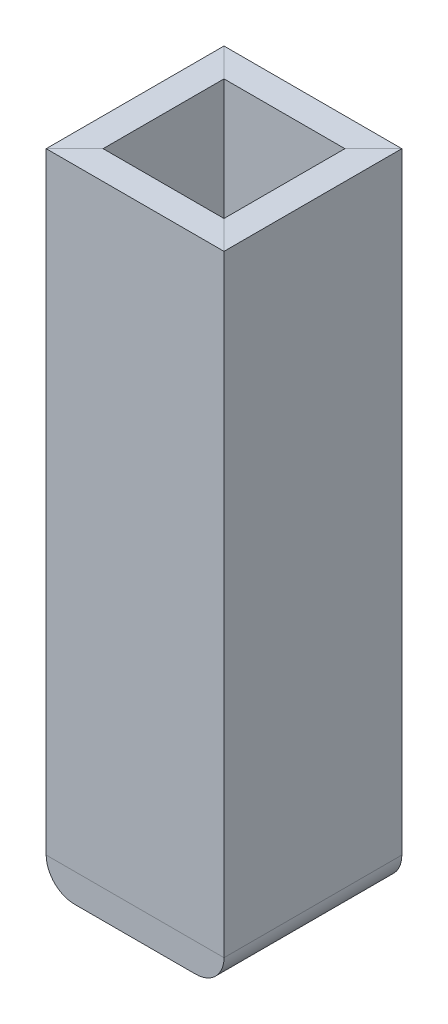
ISO-10303-21;
HEADER;
FILE_DESCRIPTION(('STEP AP214'),'2;1');
FILE_NAME('part.step','',(''),(''),'','','');
FILE_SCHEMA(('AUTOMOTIVE_DESIGN { 1 0 10303 214 1 1 1 1 }'));
ENDSEC;
DATA;
#1=APPLICATION_CONTEXT('core data for automotive mechanical design processes');
#2=APPLICATION_PROTOCOL_DEFINITION('international standard','automotive_design',2000,#1);
#3=PRODUCT_CONTEXT('',#1,'mechanical');
#4=PRODUCT('Part','Part','',(#3));
#5=PRODUCT_RELATED_PRODUCT_CATEGORY('part','',(#4));
#6=PRODUCT_DEFINITION_FORMATION('','',#4);
#7=PRODUCT_DEFINITION_CONTEXT('part definition',#1,'design');
#8=PRODUCT_DEFINITION('design','',#6,#7);
#9=PRODUCT_DEFINITION_SHAPE('','',#8);
#10=(LENGTH_UNIT() NAMED_UNIT(*) SI_UNIT(.MILLI.,.METRE.));
#11=(NAMED_UNIT(*) PLANE_ANGLE_UNIT() SI_UNIT($,.RADIAN.));
#12=(NAMED_UNIT(*) SI_UNIT($,.STERADIAN.) SOLID_ANGLE_UNIT());
#13=UNCERTAINTY_MEASURE_WITH_UNIT(LENGTH_MEASURE(1.E-05),#10,'distance_accuracy_value','');
#14=(GEOMETRIC_REPRESENTATION_CONTEXT(3) GLOBAL_UNCERTAINTY_ASSIGNED_CONTEXT((#13)) GLOBAL_UNIT_ASSIGNED_CONTEXT((#10,
#11,#12)) REPRESENTATION_CONTEXT('',''));
#15=CARTESIAN_POINT('',(0.,0.,0.));
#16=DIRECTION('',(0.,0.,1.));
#17=DIRECTION('',(1.,0.,0.));
#18=AXIS2_PLACEMENT_3D('',#15,#16,#17);
#19=CARTESIAN_POINT('',(0.,0.,0.));
#20=DIRECTION('',(-0.707106781186548,0.,0.707106781186547));
#21=DIRECTION('',(0.707106781186547,0.,0.707106781186548));
#22=AXIS2_PLACEMENT_3D('',#19,#20,#21);
#23=PLANE('',#22);
#24=DIRECTION('',(0.707106781186547,0.,0.707106781186548));
#25=VECTOR('',#24,1.);
#26=CARTESIAN_POINT('',(0.,2.,0.));
#27=LINE('',#26,#25);
#28=CARTESIAN_POINT('',(4.25,2.,4.25));
#29=VERTEX_POINT('',#28);
#30=CARTESIAN_POINT('',(6.25,2.00000000000002,6.25));
#31=VERTEX_POINT('',#30);
#32=EDGE_CURVE('E117',#29,#31,#27,.T.);
#33=ORIENTED_EDGE('',*,*,#32,.T.);
#34=DIRECTION('',(0.,-1.,0.));
#35=VECTOR('',#34,1.);
#36=CARTESIAN_POINT('',(6.25,45.,6.25));
#37=LINE('',#36,#35);
#38=CARTESIAN_POINT('',(6.25,45.,6.25));
#39=VERTEX_POINT('',#38);
#40=EDGE_CURVE('E77',#39,#31,#37,.T.);
#41=ORIENTED_EDGE('',*,*,#40,.F.);
#42=DIRECTION('',(-0.707106781186547,0.,-0.707106781186548));
#43=VECTOR('',#42,1.);
#44=CARTESIAN_POINT('',(0.,45.,0.));
#45=LINE('',#44,#43);
#46=CARTESIAN_POINT('',(4.25,45.,4.25));
#47=VERTEX_POINT('',#46);
#48=EDGE_CURVE('E143',#39,#47,#45,.T.);
#49=ORIENTED_EDGE('',*,*,#48,.T.);
#50=DIRECTION('',(0.,1.,0.));
#51=VECTOR('',#50,1.);
#52=CARTESIAN_POINT('',(4.25,-12.0208152801713,4.25));
#53=LINE('',#52,#51);
#54=EDGE_CURVE('E69',#29,#47,#53,.T.);
#55=ORIENTED_EDGE('',*,*,#54,.F.);
#56=EDGE_LOOP('',(#33,#41,#49,#55));
#57=FACE_BOUND('',#56,.T.);
#58=ADVANCED_FACE('F59',(#57),#23,.T.);
#59=CARTESIAN_POINT('',(4.25,2.,-4.25));
#60=DIRECTION('',(0.,1.,0.));
#61=DIRECTION('',(0.,0.,1.));
#62=AXIS2_PLACEMENT_3D('',#59,#60,#61);
#63=PLANE('',#62);
#64=ORIENTED_EDGE('',*,*,#32,.F.);
#65=DIRECTION('',(0.,0.,-1.));
#66=VECTOR('',#65,1.);
#67=CARTESIAN_POINT('',(4.25,2.,4.25));
#68=LINE('',#67,#66);
#69=CARTESIAN_POINT('',(4.25,2.,-4.25));
#70=VERTEX_POINT('',#69);
#71=EDGE_CURVE('E109',#29,#70,#68,.T.);
#72=ORIENTED_EDGE('',*,*,#71,.T.);
#73=DIRECTION('',(0.707106781186547,0.,-0.707106781186548));
#74=VECTOR('',#73,1.);
#75=CARTESIAN_POINT('',(4.25,2.,-4.25));
#76=LINE('',#75,#74);
#77=CARTESIAN_POINT('',(6.25,2.00000000000002,-6.25));
#78=VERTEX_POINT('',#77);
#79=EDGE_CURVE('E110',#70,#78,#76,.T.);
#80=ORIENTED_EDGE('',*,*,#79,.T.);
#81=DIRECTION('',(0.,0.,-1.));
#82=VECTOR('',#81,1.);
#83=CARTESIAN_POINT('',(6.25,2.,-6.25));
#84=LINE('',#83,#82);
#85=EDGE_CURVE('E141',#31,#78,#84,.T.);
#86=ORIENTED_EDGE('',*,*,#85,.F.);
#87=EDGE_LOOP('',(#64,#72,#80,#86));
#88=FACE_BOUND('',#87,.T.);
#89=ADVANCED_FACE('F130',(#88),#63,.F.);
#90=CARTESIAN_POINT('',(0.,0.,0.));
#91=DIRECTION('',(0.707106781186548,0.,0.707106781186547));
#92=DIRECTION('',(0.707106781186547,0.,-0.707106781186548));
#93=AXIS2_PLACEMENT_3D('',#90,#91,#92);
#94=PLANE('',#93);
#95=DIRECTION('',(0.,1.,0.));
#96=VECTOR('',#95,1.);
#97=CARTESIAN_POINT('',(4.25,-12.0208152801713,-4.25));
#98=LINE('',#97,#96);
#99=CARTESIAN_POINT('',(4.25,45.,-4.25));
#100=VERTEX_POINT('',#99);
#101=EDGE_CURVE('E112',#70,#100,#98,.T.);
#102=ORIENTED_EDGE('',*,*,#101,.T.);
#103=DIRECTION('',(-0.707106781186547,0.,0.707106781186548));
#104=VECTOR('',#103,1.);
#105=CARTESIAN_POINT('',(0.,45.,0.));
#106=LINE('',#105,#104);
#107=CARTESIAN_POINT('',(6.25,45.,-6.25));
#108=VERTEX_POINT('',#107);
#109=EDGE_CURVE('E63',#108,#100,#106,.T.);
#110=ORIENTED_EDGE('',*,*,#109,.F.);
#111=DIRECTION('',(0.,-1.,0.));
#112=VECTOR('',#111,1.);
#113=CARTESIAN_POINT('',(6.25,45.,-6.25));
#114=LINE('',#113,#112);
#115=EDGE_CURVE('E116',#108,#78,#114,.T.);
#116=ORIENTED_EDGE('',*,*,#115,.T.);
#117=ORIENTED_EDGE('',*,*,#79,.F.);
#118=EDGE_LOOP('',(#102,#110,#116,#117));
#119=FACE_BOUND('',#118,.T.);
#120=ADVANCED_FACE('F113',(#119),#94,.F.);
#121=CARTESIAN_POINT('',(0.,45.,0.));
#122=DIRECTION('',(0.,-1.,0.));
#123=DIRECTION('',(0.,0.,-1.));
#124=AXIS2_PLACEMENT_3D('',#121,#122,#123);
#125=PLANE('',#124);
#126=ORIENTED_EDGE('',*,*,#48,.F.);
#127=DIRECTION('',(0.,0.,-1.));
#128=VECTOR('',#127,1.);
#129=CARTESIAN_POINT('',(6.25,45.,6.25));
#130=LINE('',#129,#128);
#131=EDGE_CURVE('E105',#39,#108,#130,.T.);
#132=ORIENTED_EDGE('',*,*,#131,.T.);
#133=ORIENTED_EDGE('',*,*,#109,.T.);
#134=DIRECTION('',(0.,0.,-1.));
#135=VECTOR('',#134,1.);
#136=CARTESIAN_POINT('',(4.25,45.,4.25));
#137=LINE('',#136,#135);
#138=EDGE_CURVE('E12',#47,#100,#137,.T.);
#139=ORIENTED_EDGE('',*,*,#138,.F.);
#140=EDGE_LOOP('',(#126,#132,#133,#139));
#141=FACE_BOUND('',#140,.T.);
#142=ADVANCED_FACE('F61',(#141),#125,.F.);
#143=CARTESIAN_POINT('',(4.25,-12.0208152801713,4.25));
#144=DIRECTION('',(1.,0.,0.));
#145=DIRECTION('',(0.,0.,-1.));
#146=AXIS2_PLACEMENT_3D('',#143,#144,#145);
#147=PLANE('',#146);
#148=ORIENTED_EDGE('',*,*,#54,.T.);
#149=ORIENTED_EDGE('',*,*,#138,.T.);
#150=ORIENTED_EDGE('',*,*,#101,.F.);
#151=ORIENTED_EDGE('',*,*,#71,.F.);
#152=EDGE_LOOP('',(#148,#149,#150,#151));
#153=FACE_BOUND('',#152,.T.);
#154=ADVANCED_FACE('F119',(#153),#147,.F.);
#155=CARTESIAN_POINT('',(6.25,45.,6.25));
#156=DIRECTION('',(-1.,0.,0.));
#157=DIRECTION('',(0.,0.,1.));
#158=AXIS2_PLACEMENT_3D('',#155,#156,#157);
#159=PLANE('',#158);
#160=ORIENTED_EDGE('',*,*,#40,.T.);
#161=ORIENTED_EDGE('',*,*,#85,.T.);
#162=ORIENTED_EDGE('',*,*,#115,.F.);
#163=ORIENTED_EDGE('',*,*,#131,.F.);
#164=EDGE_LOOP('',(#160,#161,#162,#163));
#165=FACE_BOUND('',#164,.T.);
#166=ADVANCED_FACE('F121',(#165),#159,.F.);
#167=CLOSED_SHELL('',(#58,#89,#120,#142,#154,#166));
#168=MANIFOLD_SOLID_BREP('B2',#167);
#169=CARTESIAN_POINT('',(0.,0.,0.));
#170=DIRECTION('',(-0.707106781186548,0.,0.707106781186547));
#171=DIRECTION('',(0.707106781186547,0.,0.707106781186548));
#172=AXIS2_PLACEMENT_3D('',#169,#170,#171);
#173=PLANE('',#172);
#174=DIRECTION('',(0.707106781186547,0.,0.707106781186548));
#175=VECTOR('',#174,1.);
#176=CARTESIAN_POINT('',(0.,2.,0.));
#177=LINE('',#176,#175);
#178=CARTESIAN_POINT('',(4.25,2.,4.25));
#179=VERTEX_POINT('',#178);
#180=CARTESIAN_POINT('',(6.25,2.00000000000002,6.25));
#181=VERTEX_POINT('',#180);
#182=EDGE_CURVE('E203',#179,#181,#177,.T.);
#183=ORIENTED_EDGE('',*,*,#182,.F.);
#184=DIRECTION('',(0.,1.,0.));
#185=VECTOR('',#184,1.);
#186=CARTESIAN_POINT('',(4.25,-12.0208152801713,4.25));
#187=LINE('',#186,#185);
#188=CARTESIAN_POINT('',(4.25,45.,4.25));
#189=VERTEX_POINT('',#188);
#190=EDGE_CURVE('E57',#179,#189,#187,.T.);
#191=ORIENTED_EDGE('',*,*,#190,.T.);
#192=DIRECTION('',(-0.707106781186547,0.,-0.707106781186548));
#193=VECTOR('',#192,1.);
#194=CARTESIAN_POINT('',(0.,45.,0.));
#195=LINE('',#194,#193);
#196=CARTESIAN_POINT('',(6.25,45.,6.25));
#197=VERTEX_POINT('',#196);
#198=EDGE_CURVE('E222',#197,#189,#195,.T.);
#199=ORIENTED_EDGE('',*,*,#198,.F.);
#200=DIRECTION('',(0.,-1.,0.));
#201=VECTOR('',#200,1.);
#202=CARTESIAN_POINT('',(6.25,45.,6.25));
#203=LINE('',#202,#201);
#204=EDGE_CURVE('E208',#197,#181,#203,.T.);
#205=ORIENTED_EDGE('',*,*,#204,.T.);
#206=EDGE_LOOP('',(#183,#191,#199,#205));
#207=FACE_BOUND('',#206,.T.);
#208=ADVANCED_FACE('F200',(#207),#173,.F.);
#209=CARTESIAN_POINT('',(0.,0.,0.));
#210=DIRECTION('',(0.707106781186548,0.,0.707106781186547));
#211=DIRECTION('',(0.707106781186547,0.,-0.707106781186548));
#212=AXIS2_PLACEMENT_3D('',#209,#210,#211);
#213=PLANE('',#212);
#214=DIRECTION('',(0.,-1.,0.));
#215=VECTOR('',#214,1.);
#216=CARTESIAN_POINT('',(-6.25,45.,6.25));
#217=LINE('',#216,#215);
#218=CARTESIAN_POINT('',(-6.25,45.,6.25));
#219=VERTEX_POINT('',#218);
#220=CARTESIAN_POINT('',(-6.25,2.00000000000002,6.25));
#221=VERTEX_POINT('',#220);
#222=EDGE_CURVE('E256',#219,#221,#217,.T.);
#223=ORIENTED_EDGE('',*,*,#222,.F.);
#224=DIRECTION('',(-0.707106781186547,0.,0.707106781186548));
#225=VECTOR('',#224,1.);
#226=CARTESIAN_POINT('',(0.,45.,0.));
#227=LINE('',#226,#225);
#228=CARTESIAN_POINT('',(-4.25,45.,4.25));
#229=VERTEX_POINT('',#228);
#230=EDGE_CURVE('E253',#229,#219,#227,.T.);
#231=ORIENTED_EDGE('',*,*,#230,.F.);
#232=DIRECTION('',(0.,1.,0.));
#233=VECTOR('',#232,1.);
#234=CARTESIAN_POINT('',(-4.25,-12.0208152801713,4.25));
#235=LINE('',#234,#233);
#236=CARTESIAN_POINT('',(-4.25,2.,4.25));
#237=VERTEX_POINT('',#236);
#238=EDGE_CURVE('E243',#237,#229,#235,.T.);
#239=ORIENTED_EDGE('',*,*,#238,.F.);
#240=DIRECTION('',(0.707106781186547,0.,-0.707106781186548));
#241=VECTOR('',#240,1.);
#242=CARTESIAN_POINT('',(4.25,2.,-4.25));
#243=LINE('',#242,#241);
#244=EDGE_CURVE('E257',#221,#237,#243,.T.);
#245=ORIENTED_EDGE('',*,*,#244,.F.);
#246=EDGE_LOOP('',(#223,#231,#239,#245));
#247=FACE_BOUND('',#246,.T.);
#248=ADVANCED_FACE('F254',(#247),#213,.F.);
#249=CARTESIAN_POINT('',(4.25,2.,-4.25));
#250=DIRECTION('',(0.,1.,0.));
#251=DIRECTION('',(0.,0.,1.));
#252=AXIS2_PLACEMENT_3D('',#249,#250,#251);
#253=PLANE('',#252);
#254=DIRECTION('',(1.,0.,0.));
#255=VECTOR('',#254,1.);
#256=CARTESIAN_POINT('',(-4.25,2.,4.25));
#257=LINE('',#256,#255);
#258=EDGE_CURVE('E248',#237,#179,#257,.T.);
#259=ORIENTED_EDGE('',*,*,#258,.T.);
#260=ORIENTED_EDGE('',*,*,#182,.T.);
#261=DIRECTION('',(1.,0.,0.));
#262=VECTOR('',#261,1.);
#263=CARTESIAN_POINT('',(-6.25,2.,6.25));
#264=LINE('',#263,#262);
#265=EDGE_CURVE('E262',#221,#181,#264,.T.);
#266=ORIENTED_EDGE('',*,*,#265,.F.);
#267=ORIENTED_EDGE('',*,*,#244,.T.);
#268=EDGE_LOOP('',(#259,#260,#266,#267));
#269=FACE_BOUND('',#268,.T.);
#270=ADVANCED_FACE('F272',(#269),#253,.F.);
#271=CARTESIAN_POINT('',(0.,45.,0.));
#272=DIRECTION('',(0.,-1.,0.));
#273=DIRECTION('',(0.,0.,-1.));
#274=AXIS2_PLACEMENT_3D('',#271,#272,#273);
#275=PLANE('',#274);
#276=DIRECTION('',(1.,0.,0.));
#277=VECTOR('',#276,1.);
#278=CARTESIAN_POINT('',(-6.25,45.,6.25));
#279=LINE('',#278,#277);
#280=EDGE_CURVE('E250',#219,#197,#279,.T.);
#281=ORIENTED_EDGE('',*,*,#280,.T.);
#282=ORIENTED_EDGE('',*,*,#198,.T.);
#283=DIRECTION('',(1.,0.,0.));
#284=VECTOR('',#283,1.);
#285=CARTESIAN_POINT('',(-4.25,45.,4.25));
#286=LINE('',#285,#284);
#287=EDGE_CURVE('E246',#229,#189,#286,.T.);
#288=ORIENTED_EDGE('',*,*,#287,.F.);
#289=ORIENTED_EDGE('',*,*,#230,.T.);
#290=EDGE_LOOP('',(#281,#282,#288,#289));
#291=FACE_BOUND('',#290,.T.);
#292=ADVANCED_FACE('F259',(#291),#275,.F.);
#293=CARTESIAN_POINT('',(-6.25,45.,6.25));
#294=DIRECTION('',(0.,0.,-1.));
#295=DIRECTION('',(-1.,0.,0.));
#296=AXIS2_PLACEMENT_3D('',#293,#294,#295);
#297=PLANE('',#296);
#298=ORIENTED_EDGE('',*,*,#222,.T.);
#299=ORIENTED_EDGE('',*,*,#265,.T.);
#300=ORIENTED_EDGE('',*,*,#204,.F.);
#301=ORIENTED_EDGE('',*,*,#280,.F.);
#302=EDGE_LOOP('',(#298,#299,#300,#301));
#303=FACE_BOUND('',#302,.T.);
#304=ADVANCED_FACE('F274',(#303),#297,.F.);
#305=CARTESIAN_POINT('',(-4.25,-12.0208152801713,4.25));
#306=DIRECTION('',(0.,0.,1.));
#307=DIRECTION('',(1.,0.,0.));
#308=AXIS2_PLACEMENT_3D('',#305,#306,#307);
#309=PLANE('',#308);
#310=ORIENTED_EDGE('',*,*,#238,.T.);
#311=ORIENTED_EDGE('',*,*,#287,.T.);
#312=ORIENTED_EDGE('',*,*,#190,.F.);
#313=ORIENTED_EDGE('',*,*,#258,.F.);
#314=EDGE_LOOP('',(#310,#311,#312,#313));
#315=FACE_BOUND('',#314,.T.);
#316=ADVANCED_FACE('F245',(#315),#309,.F.);
#317=CLOSED_SHELL('',(#208,#248,#270,#292,#304,#316));
#318=MANIFOLD_SOLID_BREP('B6',#317);
#319=CARTESIAN_POINT('',(0.,0.,0.));
#320=DIRECTION('',(-0.707106781186548,0.,0.707106781186547));
#321=DIRECTION('',(0.707106781186547,0.,0.707106781186548));
#322=AXIS2_PLACEMENT_3D('',#319,#320,#321);
#323=PLANE('',#322);
#324=DIRECTION('',(0.,-1.,0.));
#325=VECTOR('',#324,1.);
#326=CARTESIAN_POINT('',(-6.25,45.,-6.25));
#327=LINE('',#326,#325);
#328=CARTESIAN_POINT('',(-6.25,45.,-6.25));
#329=VERTEX_POINT('',#328);
#330=CARTESIAN_POINT('',(-6.25,2.00000000000002,-6.25));
#331=VERTEX_POINT('',#330);
#332=EDGE_CURVE('E382',#329,#331,#327,.T.);
#333=ORIENTED_EDGE('',*,*,#332,.T.);
#334=DIRECTION('',(0.707106781186547,0.,0.707106781186548));
#335=VECTOR('',#334,1.);
#336=CARTESIAN_POINT('',(0.,2.,0.));
#337=LINE('',#336,#335);
#338=CARTESIAN_POINT('',(-4.25,2.,-4.25));
#339=VERTEX_POINT('',#338);
#340=EDGE_CURVE('E371',#331,#339,#337,.T.);
#341=ORIENTED_EDGE('',*,*,#340,.T.);
#342=DIRECTION('',(0.,1.,0.));
#343=VECTOR('',#342,1.);
#344=CARTESIAN_POINT('',(-4.25,-12.0208152801713,-4.25));
#345=LINE('',#344,#343);
#346=CARTESIAN_POINT('',(-4.25,45.,-4.25));
#347=VERTEX_POINT('',#346);
#348=EDGE_CURVE('E380',#339,#347,#345,.T.);
#349=ORIENTED_EDGE('',*,*,#348,.T.);
#350=DIRECTION('',(-0.707106781186547,0.,-0.707106781186548));
#351=VECTOR('',#350,1.);
#352=CARTESIAN_POINT('',(0.,45.,0.));
#353=LINE('',#352,#351);
#354=EDGE_CURVE('E384',#347,#329,#353,.T.);
#355=ORIENTED_EDGE('',*,*,#354,.T.);
#356=EDGE_LOOP('',(#333,#341,#349,#355));
#357=FACE_BOUND('',#356,.T.);
#358=ADVANCED_FACE('F328',(#357),#323,.T.);
#359=CARTESIAN_POINT('',(4.25,2.,-4.25));
#360=DIRECTION('',(0.,1.,0.));
#361=DIRECTION('',(0.,0.,1.));
#362=AXIS2_PLACEMENT_3D('',#359,#360,#361);
#363=PLANE('',#362);
#364=ORIENTED_EDGE('',*,*,#340,.F.);
#365=DIRECTION('',(-1.,0.,0.));
#366=VECTOR('',#365,1.);
#367=CARTESIAN_POINT('',(-6.25,2.,-6.25));
#368=LINE('',#367,#366);
#369=CARTESIAN_POINT('',(6.25,2.00000000000002,-6.25));
#370=VERTEX_POINT('',#369);
#371=EDGE_CURVE('E375',#370,#331,#368,.T.);
#372=ORIENTED_EDGE('',*,*,#371,.F.);
#373=DIRECTION('',(0.707106781186547,0.,-0.707106781186548));
#374=VECTOR('',#373,1.);
#375=CARTESIAN_POINT('',(4.25,2.,-4.25));
#376=LINE('',#375,#374);
#377=CARTESIAN_POINT('',(4.25,2.,-4.25));
#378=VERTEX_POINT('',#377);
#379=EDGE_CURVE('E336',#378,#370,#376,.T.);
#380=ORIENTED_EDGE('',*,*,#379,.F.);
#381=DIRECTION('',(-1.,0.,0.));
#382=VECTOR('',#381,1.);
#383=CARTESIAN_POINT('',(-4.25,2.,-4.25));
#384=LINE('',#383,#382);
#385=EDGE_CURVE('E368',#378,#339,#384,.T.);
#386=ORIENTED_EDGE('',*,*,#385,.T.);
#387=EDGE_LOOP('',(#364,#372,#380,#386));
#388=FACE_BOUND('',#387,.T.);
#389=ADVANCED_FACE('F330',(#388),#363,.F.);
#390=CARTESIAN_POINT('',(0.,45.,0.));
#391=DIRECTION('',(0.,-1.,0.));
#392=DIRECTION('',(0.,0.,-1.));
#393=AXIS2_PLACEMENT_3D('',#390,#391,#392);
#394=PLANE('',#393);
#395=ORIENTED_EDGE('',*,*,#354,.F.);
#396=DIRECTION('',(-1.,0.,0.));
#397=VECTOR('',#396,1.);
#398=CARTESIAN_POINT('',(-4.25,45.,-4.25));
#399=LINE('',#398,#397);
#400=CARTESIAN_POINT('',(4.25,45.,-4.25));
#401=VERTEX_POINT('',#400);
#402=EDGE_CURVE('E383',#401,#347,#399,.T.);
#403=ORIENTED_EDGE('',*,*,#402,.F.);
#404=DIRECTION('',(-0.707106781186547,0.,0.707106781186548));
#405=VECTOR('',#404,1.);
#406=CARTESIAN_POINT('',(0.,45.,0.));
#407=LINE('',#406,#405);
#408=CARTESIAN_POINT('',(6.25,45.,-6.25));
#409=VERTEX_POINT('',#408);
#410=EDGE_CURVE('E198',#409,#401,#407,.T.);
#411=ORIENTED_EDGE('',*,*,#410,.F.);
#412=DIRECTION('',(-1.,0.,0.));
#413=VECTOR('',#412,1.);
#414=CARTESIAN_POINT('',(-6.25,45.,-6.25));
#415=LINE('',#414,#413);
#416=EDGE_CURVE('E395',#409,#329,#415,.T.);
#417=ORIENTED_EDGE('',*,*,#416,.T.);
#418=EDGE_LOOP('',(#395,#403,#411,#417));
#419=FACE_BOUND('',#418,.T.);
#420=ADVANCED_FACE('F401',(#419),#394,.F.);
#421=CARTESIAN_POINT('',(0.,0.,0.));
#422=DIRECTION('',(0.707106781186548,0.,0.707106781186547));
#423=DIRECTION('',(0.707106781186547,0.,-0.707106781186548));
#424=AXIS2_PLACEMENT_3D('',#421,#422,#423);
#425=PLANE('',#424);
#426=DIRECTION('',(0.,1.,0.));
#427=VECTOR('',#426,1.);
#428=CARTESIAN_POINT('',(4.25,-12.0208152801713,-4.25));
#429=LINE('',#428,#427);
#430=EDGE_CURVE('E342',#378,#401,#429,.T.);
#431=ORIENTED_EDGE('',*,*,#430,.F.);
#432=ORIENTED_EDGE('',*,*,#379,.T.);
#433=DIRECTION('',(0.,-1.,0.));
#434=VECTOR('',#433,1.);
#435=CARTESIAN_POINT('',(6.25,45.,-6.25));
#436=LINE('',#435,#434);
#437=EDGE_CURVE('E350',#409,#370,#436,.T.);
#438=ORIENTED_EDGE('',*,*,#437,.F.);
#439=ORIENTED_EDGE('',*,*,#410,.T.);
#440=EDGE_LOOP('',(#431,#432,#438,#439));
#441=FACE_BOUND('',#440,.T.);
#442=ADVANCED_FACE('F392',(#441),#425,.T.);
#443=CARTESIAN_POINT('',(-4.25,-12.0208152801713,-4.25));
#444=DIRECTION('',(0.,0.,-1.));
#445=DIRECTION('',(-1.,0.,0.));
#446=AXIS2_PLACEMENT_3D('',#443,#444,#445);
#447=PLANE('',#446);
#448=ORIENTED_EDGE('',*,*,#430,.T.);
#449=ORIENTED_EDGE('',*,*,#402,.T.);
#450=ORIENTED_EDGE('',*,*,#348,.F.);
#451=ORIENTED_EDGE('',*,*,#385,.F.);
#452=EDGE_LOOP('',(#448,#449,#450,#451));
#453=FACE_BOUND('',#452,.T.);
#454=ADVANCED_FACE('F386',(#453),#447,.F.);
#455=CARTESIAN_POINT('',(-6.25,45.,-6.25));
#456=DIRECTION('',(0.,0.,1.));
#457=DIRECTION('',(1.,0.,0.));
#458=AXIS2_PLACEMENT_3D('',#455,#456,#457);
#459=PLANE('',#458);
#460=ORIENTED_EDGE('',*,*,#437,.T.);
#461=ORIENTED_EDGE('',*,*,#371,.T.);
#462=ORIENTED_EDGE('',*,*,#332,.F.);
#463=ORIENTED_EDGE('',*,*,#416,.F.);
#464=EDGE_LOOP('',(#460,#461,#462,#463));
#465=FACE_BOUND('',#464,.T.);
#466=ADVANCED_FACE('F402',(#465),#459,.F.);
#467=CLOSED_SHELL('',(#358,#389,#420,#442,#454,#466));
#468=MANIFOLD_SOLID_BREP('B51',#467);
#469=CARTESIAN_POINT('',(0.,0.,0.));
#470=DIRECTION('',(-0.707106781186548,0.,0.707106781186547));
#471=DIRECTION('',(0.707106781186547,0.,0.707106781186548));
#472=AXIS2_PLACEMENT_3D('',#469,#470,#471);
#473=PLANE('',#472);
#474=DIRECTION('',(0.,-1.,0.));
#475=VECTOR('',#474,1.);
#476=CARTESIAN_POINT('',(-6.25,45.,-6.25));
#477=LINE('',#476,#475);
#478=CARTESIAN_POINT('',(-6.25,45.,-6.25));
#479=VERTEX_POINT('',#478);
#480=CARTESIAN_POINT('',(-6.25,2.00000000000002,-6.25));
#481=VERTEX_POINT('',#480);
#482=EDGE_CURVE('E521',#479,#481,#477,.T.);
#483=ORIENTED_EDGE('',*,*,#482,.F.);
#484=DIRECTION('',(-0.707106781186547,0.,-0.707106781186548));
#485=VECTOR('',#484,1.);
#486=CARTESIAN_POINT('',(0.,45.,0.));
#487=LINE('',#486,#485);
#488=CARTESIAN_POINT('',(-4.25,45.,-4.25));
#489=VERTEX_POINT('',#488);
#490=EDGE_CURVE('E462',#489,#479,#487,.T.);
#491=ORIENTED_EDGE('',*,*,#490,.F.);
#492=DIRECTION('',(0.,1.,0.));
#493=VECTOR('',#492,1.);
#494=CARTESIAN_POINT('',(-4.25,-12.0208152801713,-4.25));
#495=LINE('',#494,#493);
#496=CARTESIAN_POINT('',(-4.25,2.,-4.25));
#497=VERTEX_POINT('',#496);
#498=EDGE_CURVE('E469',#497,#489,#495,.T.);
#499=ORIENTED_EDGE('',*,*,#498,.F.);
#500=DIRECTION('',(0.707106781186547,0.,0.707106781186548));
#501=VECTOR('',#500,1.);
#502=CARTESIAN_POINT('',(0.,2.,0.));
#503=LINE('',#502,#501);
#504=EDGE_CURVE('E326',#481,#497,#503,.T.);
#505=ORIENTED_EDGE('',*,*,#504,.F.);
#506=EDGE_LOOP('',(#483,#491,#499,#505));
#507=FACE_BOUND('',#506,.T.);
#508=ADVANCED_FACE('F455',(#507),#473,.F.);
#509=CARTESIAN_POINT('',(0.,45.,0.));
#510=DIRECTION('',(0.,-1.,0.));
#511=DIRECTION('',(0.,0.,-1.));
#512=AXIS2_PLACEMENT_3D('',#509,#510,#511);
#513=PLANE('',#512);
#514=DIRECTION('',(0.,0.,1.));
#515=VECTOR('',#514,1.);
#516=CARTESIAN_POINT('',(-4.25,45.,4.25));
#517=LINE('',#516,#515);
#518=CARTESIAN_POINT('',(-4.25,45.,4.25));
#519=VERTEX_POINT('',#518);
#520=EDGE_CURVE('E492',#489,#519,#517,.T.);
#521=ORIENTED_EDGE('',*,*,#520,.F.);
#522=ORIENTED_EDGE('',*,*,#490,.T.);
#523=DIRECTION('',(0.,0.,1.));
#524=VECTOR('',#523,1.);
#525=CARTESIAN_POINT('',(-6.25,45.,6.25));
#526=LINE('',#525,#524);
#527=CARTESIAN_POINT('',(-6.25,45.,6.25));
#528=VERTEX_POINT('',#527);
#529=EDGE_CURVE('E502',#479,#528,#526,.T.);
#530=ORIENTED_EDGE('',*,*,#529,.T.);
#531=DIRECTION('',(-0.707106781186547,0.,0.707106781186548));
#532=VECTOR('',#531,1.);
#533=CARTESIAN_POINT('',(0.,45.,0.));
#534=LINE('',#533,#532);
#535=EDGE_CURVE('E499',#519,#528,#534,.T.);
#536=ORIENTED_EDGE('',*,*,#535,.F.);
#537=EDGE_LOOP('',(#521,#522,#530,#536));
#538=FACE_BOUND('',#537,.T.);
#539=ADVANCED_FACE('F500',(#538),#513,.F.);
#540=CARTESIAN_POINT('',(0.,0.,0.));
#541=DIRECTION('',(0.707106781186548,0.,0.707106781186547));
#542=DIRECTION('',(0.707106781186547,0.,-0.707106781186548));
#543=AXIS2_PLACEMENT_3D('',#540,#541,#542);
#544=PLANE('',#543);
#545=DIRECTION('',(0.,-1.,0.));
#546=VECTOR('',#545,1.);
#547=CARTESIAN_POINT('',(-6.25,45.,6.25));
#548=LINE('',#547,#546);
#549=CARTESIAN_POINT('',(-6.25,2.00000000000002,6.25));
#550=VERTEX_POINT('',#549);
#551=EDGE_CURVE('E507',#528,#550,#548,.T.);
#552=ORIENTED_EDGE('',*,*,#551,.T.);
#553=DIRECTION('',(0.707106781186547,0.,-0.707106781186548));
#554=VECTOR('',#553,1.);
#555=CARTESIAN_POINT('',(4.25,2.,-4.25));
#556=LINE('',#555,#554);
#557=CARTESIAN_POINT('',(-4.25,2.,4.25));
#558=VERTEX_POINT('',#557);
#559=EDGE_CURVE('E506',#550,#558,#556,.T.);
#560=ORIENTED_EDGE('',*,*,#559,.T.);
#561=DIRECTION('',(0.,1.,0.));
#562=VECTOR('',#561,1.);
#563=CARTESIAN_POINT('',(-4.25,-12.0208152801713,4.25));
#564=LINE('',#563,#562);
#565=EDGE_CURVE('E496',#558,#519,#564,.T.);
#566=ORIENTED_EDGE('',*,*,#565,.T.);
#567=ORIENTED_EDGE('',*,*,#535,.T.);
#568=EDGE_LOOP('',(#552,#560,#566,#567));
#569=FACE_BOUND('',#568,.T.);
#570=ADVANCED_FACE('F510',(#569),#544,.T.);
#571=CARTESIAN_POINT('',(4.25,2.,-4.25));
#572=DIRECTION('',(0.,1.,0.));
#573=DIRECTION('',(0.,0.,1.));
#574=AXIS2_PLACEMENT_3D('',#571,#572,#573);
#575=PLANE('',#574);
#576=DIRECTION('',(0.,0.,1.));
#577=VECTOR('',#576,1.);
#578=CARTESIAN_POINT('',(-6.25,2.,6.25));
#579=LINE('',#578,#577);
#580=EDGE_CURVE('E518',#481,#550,#579,.T.);
#581=ORIENTED_EDGE('',*,*,#580,.F.);
#582=ORIENTED_EDGE('',*,*,#504,.T.);
#583=DIRECTION('',(0.,0.,1.));
#584=VECTOR('',#583,1.);
#585=CARTESIAN_POINT('',(-4.25,2.,4.25));
#586=LINE('',#585,#584);
#587=EDGE_CURVE('E515',#497,#558,#586,.T.);
#588=ORIENTED_EDGE('',*,*,#587,.T.);
#589=ORIENTED_EDGE('',*,*,#559,.F.);
#590=EDGE_LOOP('',(#581,#582,#588,#589));
#591=FACE_BOUND('',#590,.T.);
#592=ADVANCED_FACE('F528',(#591),#575,.F.);
#593=CARTESIAN_POINT('',(-6.25,45.,6.25));
#594=DIRECTION('',(1.,0.,0.));
#595=DIRECTION('',(0.,0.,-1.));
#596=AXIS2_PLACEMENT_3D('',#593,#594,#595);
#597=PLANE('',#596);
#598=ORIENTED_EDGE('',*,*,#482,.T.);
#599=ORIENTED_EDGE('',*,*,#580,.T.);
#600=ORIENTED_EDGE('',*,*,#551,.F.);
#601=ORIENTED_EDGE('',*,*,#529,.F.);
#602=EDGE_LOOP('',(#598,#599,#600,#601));
#603=FACE_BOUND('',#602,.T.);
#604=ADVANCED_FACE('F526',(#603),#597,.F.);
#605=CARTESIAN_POINT('',(-4.25,-12.0208152801713,4.25));
#606=DIRECTION('',(-1.,0.,0.));
#607=DIRECTION('',(0.,0.,1.));
#608=AXIS2_PLACEMENT_3D('',#605,#606,#607);
#609=PLANE('',#608);
#610=ORIENTED_EDGE('',*,*,#498,.T.);
#611=ORIENTED_EDGE('',*,*,#520,.T.);
#612=ORIENTED_EDGE('',*,*,#565,.F.);
#613=ORIENTED_EDGE('',*,*,#587,.F.);
#614=EDGE_LOOP('',(#610,#611,#612,#613));
#615=FACE_BOUND('',#614,.T.);
#616=ADVANCED_FACE('F494',(#615),#609,.F.);
#617=CLOSED_SHELL('',(#508,#539,#570,#592,#604,#616));
#618=MANIFOLD_SOLID_BREP('B192',#617);
#619=CARTESIAN_POINT('',(4.25,2.,-4.25));
#620=DIRECTION('',(0.,1.,0.));
#621=DIRECTION('',(0.,0.,1.));
#622=AXIS2_PLACEMENT_3D('',#619,#620,#621);
#623=PLANE('',#622);
#624=DIRECTION('',(0.,0.,-1.));
#625=VECTOR('',#624,1.);
#626=CARTESIAN_POINT('',(6.25,2.,-6.25));
#627=LINE('',#626,#625);
#628=CARTESIAN_POINT('',(6.25,2.00000000000002,6.25));
#629=VERTEX_POINT('',#628);
#630=CARTESIAN_POINT('',(6.25,2.00000000000002,-6.25));
#631=VERTEX_POINT('',#630);
#632=EDGE_CURVE('E577',#629,#631,#627,.T.);
#633=ORIENTED_EDGE('',*,*,#632,.T.);
#634=DIRECTION('',(-1.,0.,0.));
#635=VECTOR('',#634,1.);
#636=CARTESIAN_POINT('',(-6.25,2.,-6.25));
#637=LINE('',#636,#635);
#638=CARTESIAN_POINT('',(-6.25,2.00000000000002,-6.25));
#639=VERTEX_POINT('',#638);
#640=EDGE_CURVE('E623',#631,#639,#637,.T.);
#641=ORIENTED_EDGE('',*,*,#640,.T.);
#642=DIRECTION('',(0.,0.,1.));
#643=VECTOR('',#642,1.);
#644=CARTESIAN_POINT('',(-6.25,2.,6.25));
#645=LINE('',#644,#643);
#646=CARTESIAN_POINT('',(-6.25,2.00000000000002,6.25));
#647=VERTEX_POINT('',#646);
#648=EDGE_CURVE('E633',#639,#647,#645,.T.);
#649=ORIENTED_EDGE('',*,*,#648,.T.);
#650=DIRECTION('',(1.,0.,0.));
#651=VECTOR('',#650,1.);
#652=CARTESIAN_POINT('',(-6.25,2.,6.25));
#653=LINE('',#652,#651);
#654=EDGE_CURVE('E629',#647,#629,#653,.T.);
#655=ORIENTED_EDGE('',*,*,#654,.T.);
#656=EDGE_LOOP('',(#633,#641,#649,#655));
#657=FACE_BOUND('',#656,.T.);
#658=ADVANCED_FACE('F573',(#657),#623,.T.);
#659=CARTESIAN_POINT('',(-6.25,45.,6.25));
#660=DIRECTION('',(0.,0.,-1.));
#661=DIRECTION('',(-1.,0.,0.));
#662=AXIS2_PLACEMENT_3D('',#659,#660,#661);
#663=PLANE('',#662);
#664=ORIENTED_EDGE('',*,*,#654,.F.);
#665=CARTESIAN_POINT('',(-4.25,2.,6.25));
#666=DIRECTION('',(0.,0.,-1.));
#667=DIRECTION('',(-1.,0.,0.));
#668=AXIS2_PLACEMENT_3D('',#665,#666,#667);
#669=CIRCLE('',#668,2.);
#670=CARTESIAN_POINT('',(-4.25,0.,6.25));
#671=VERTEX_POINT('',#670);
#672=EDGE_CURVE('E641',#647,#671,#669,.F.);
#673=ORIENTED_EDGE('',*,*,#672,.T.);
#674=DIRECTION('',(1.,0.,0.));
#675=VECTOR('',#674,1.);
#676=CARTESIAN_POINT('',(-6.25,0.,6.25));
#677=LINE('',#676,#675);
#678=CARTESIAN_POINT('',(4.25,0.,6.25));
#679=VERTEX_POINT('',#678);
#680=EDGE_CURVE('E582',#671,#679,#677,.T.);
#681=ORIENTED_EDGE('',*,*,#680,.T.);
#682=CARTESIAN_POINT('',(4.25,2.,6.25));
#683=DIRECTION('',(0.,0.,-1.));
#684=DIRECTION('',(-1.,0.,0.));
#685=AXIS2_PLACEMENT_3D('',#682,#683,#684);
#686=CIRCLE('',#685,2.);
#687=EDGE_CURVE('E628',#679,#629,#686,.F.);
#688=ORIENTED_EDGE('',*,*,#687,.T.);
#689=EDGE_LOOP('',(#664,#673,#681,#688));
#690=FACE_BOUND('',#689,.T.);
#691=ADVANCED_FACE('F644',(#690),#663,.F.);
#692=CARTESIAN_POINT('',(0.,0.,0.));
#693=DIRECTION('',(0.,-1.,0.));
#694=DIRECTION('',(0.,0.,-1.));
#695=AXIS2_PLACEMENT_3D('',#692,#693,#694);
#696=PLANE('',#695);
#697=DIRECTION('',(-1.,0.,0.));
#698=VECTOR('',#697,1.);
#699=CARTESIAN_POINT('',(-6.25,0.,-6.25));
#700=LINE('',#699,#698);
#701=CARTESIAN_POINT('',(4.25,0.,-6.25));
#702=VERTEX_POINT('',#701);
#703=CARTESIAN_POINT('',(-4.25,0.,-6.25));
#704=VERTEX_POINT('',#703);
#705=EDGE_CURVE('E453',#702,#704,#700,.T.);
#706=ORIENTED_EDGE('',*,*,#705,.F.);
#707=DIRECTION('',(0.,0.,-1.));
#708=VECTOR('',#707,1.);
#709=CARTESIAN_POINT('',(4.25,0.,6.25));
#710=LINE('',#709,#708);
#711=EDGE_CURVE('E619',#702,#679,#710,.F.);
#712=ORIENTED_EDGE('',*,*,#711,.T.);
#713=ORIENTED_EDGE('',*,*,#680,.F.);
#714=DIRECTION('',(0.,0.,1.));
#715=VECTOR('',#714,1.);
#716=CARTESIAN_POINT('',(-4.25,0.,-6.25));
#717=LINE('',#716,#715);
#718=EDGE_CURVE('E596',#671,#704,#717,.F.);
#719=ORIENTED_EDGE('',*,*,#718,.T.);
#720=EDGE_LOOP('',(#706,#712,#713,#719));
#721=FACE_BOUND('',#720,.T.);
#722=ADVANCED_FACE('F645',(#721),#696,.T.);
#723=CARTESIAN_POINT('',(-6.25,45.,-6.25));
#724=DIRECTION('',(0.,0.,1.));
#725=DIRECTION('',(1.,0.,0.));
#726=AXIS2_PLACEMENT_3D('',#723,#724,#725);
#727=PLANE('',#726);
#728=ORIENTED_EDGE('',*,*,#640,.F.);
#729=CARTESIAN_POINT('',(4.25,2.,-6.25));
#730=DIRECTION('',(0.,0.,1.));
#731=DIRECTION('',(1.,0.,0.));
#732=AXIS2_PLACEMENT_3D('',#729,#730,#731);
#733=CIRCLE('',#732,2.);
#734=EDGE_CURVE('E589',#631,#702,#733,.F.);
#735=ORIENTED_EDGE('',*,*,#734,.T.);
#736=ORIENTED_EDGE('',*,*,#705,.T.);
#737=CARTESIAN_POINT('',(-4.25,2.,-6.25));
#738=DIRECTION('',(0.,0.,1.));
#739=DIRECTION('',(1.,0.,0.));
#740=AXIS2_PLACEMENT_3D('',#737,#738,#739);
#741=CIRCLE('',#740,2.);
#742=EDGE_CURVE('E620',#704,#639,#741,.F.);
#743=ORIENTED_EDGE('',*,*,#742,.T.);
#744=EDGE_LOOP('',(#728,#735,#736,#743));
#745=FACE_BOUND('',#744,.T.);
#746=ADVANCED_FACE('F575',(#745),#727,.F.);
#747=CARTESIAN_POINT('',(-4.25,2.,6.25));
#748=DIRECTION('',(0.,0.,-1.));
#749=DIRECTION('',(-1.,0.,0.));
#750=AXIS2_PLACEMENT_3D('',#747,#748,#749);
#751=CYLINDRICAL_SURFACE('',#750,2.);
#752=ORIENTED_EDGE('',*,*,#742,.F.);
#753=ORIENTED_EDGE('',*,*,#718,.F.);
#754=ORIENTED_EDGE('',*,*,#672,.F.);
#755=ORIENTED_EDGE('',*,*,#648,.F.);
#756=EDGE_LOOP('',(#752,#753,#754,#755));
#757=FACE_BOUND('',#756,.T.);
#758=ADVANCED_FACE('F647',(#757),#751,.T.);
#759=CARTESIAN_POINT('',(4.25,2.,6.25));
#760=DIRECTION('',(0.,0.,1.));
#761=DIRECTION('',(1.,0.,0.));
#762=AXIS2_PLACEMENT_3D('',#759,#760,#761);
#763=CYLINDRICAL_SURFACE('',#762,2.);
#764=ORIENTED_EDGE('',*,*,#687,.F.);
#765=ORIENTED_EDGE('',*,*,#711,.F.);
#766=ORIENTED_EDGE('',*,*,#734,.F.);
#767=ORIENTED_EDGE('',*,*,#632,.F.);
#768=EDGE_LOOP('',(#764,#765,#766,#767));
#769=FACE_BOUND('',#768,.T.);
#770=ADVANCED_FACE('F617',(#769),#763,.T.);
#771=CLOSED_SHELL('',(#658,#691,#722,#746,#758,#770));
#772=MANIFOLD_SOLID_BREP('B320',#771);
#773=ADVANCED_BREP_SHAPE_REPRESENTATION('',(#18,#168,#318,#468,#618,#772),#14);
#774=SHAPE_DEFINITION_REPRESENTATION(#9,#773);
ENDSEC;
END-ISO-10303-21;
